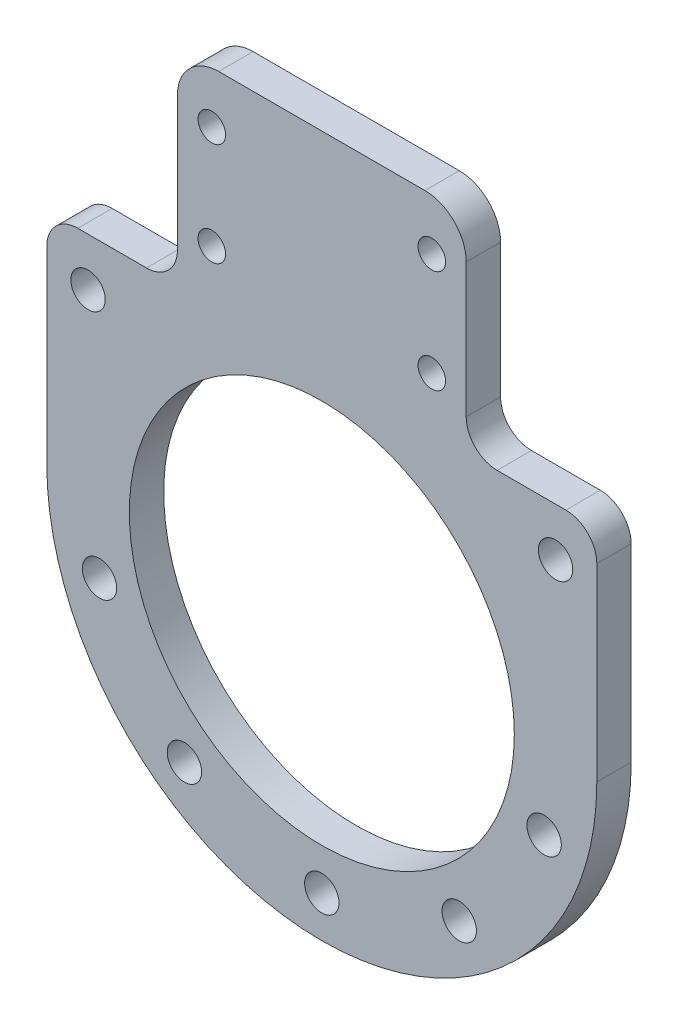
ISO-10303-21;
HEADER;
FILE_DESCRIPTION(('STEP AP214'),'2;1');
FILE_NAME('part.step','',(''),(''),'','','');
FILE_SCHEMA(('AUTOMOTIVE_DESIGN { 1 0 10303 214 1 1 1 1 }'));
ENDSEC;
DATA;
#1=APPLICATION_CONTEXT('core data for automotive mechanical design processes');
#2=APPLICATION_PROTOCOL_DEFINITION('international standard','automotive_design',2000,#1);
#3=PRODUCT_CONTEXT('',#1,'mechanical');
#4=PRODUCT('Part','Part','',(#3));
#5=PRODUCT_RELATED_PRODUCT_CATEGORY('part','',(#4));
#6=PRODUCT_DEFINITION_FORMATION('','',#4);
#7=PRODUCT_DEFINITION_CONTEXT('part definition',#1,'design');
#8=PRODUCT_DEFINITION('design','',#6,#7);
#9=PRODUCT_DEFINITION_SHAPE('','',#8);
#10=(LENGTH_UNIT() NAMED_UNIT(*) SI_UNIT(.MILLI.,.METRE.));
#11=(NAMED_UNIT(*) PLANE_ANGLE_UNIT() SI_UNIT($,.RADIAN.));
#12=(NAMED_UNIT(*) SI_UNIT($,.STERADIAN.) SOLID_ANGLE_UNIT());
#13=UNCERTAINTY_MEASURE_WITH_UNIT(LENGTH_MEASURE(1.E-05),#10,'distance_accuracy_value','');
#14=(GEOMETRIC_REPRESENTATION_CONTEXT(3) GLOBAL_UNCERTAINTY_ASSIGNED_CONTEXT((#13)) GLOBAL_UNIT_ASSIGNED_CONTEXT((#10,
#11,#12)) REPRESENTATION_CONTEXT('',''));
#15=CARTESIAN_POINT('',(0.,0.,0.));
#16=DIRECTION('',(0.,0.,1.));
#17=DIRECTION('',(1.,0.,0.));
#18=AXIS2_PLACEMENT_3D('',#15,#16,#17);
#19=CARTESIAN_POINT('',(-26.,-32.8765293462021,5.));
#20=DIRECTION('',(1.,0.,0.));
#21=DIRECTION('',(0.,0.,-1.));
#22=AXIS2_PLACEMENT_3D('',#19,#20,#21);
#23=PLANE('',#22);
#24=DIRECTION('',(0.,-1.,0.));
#25=VECTOR('',#24,1.);
#26=CARTESIAN_POINT('',(-26.,-32.8765293462021,5.));
#27=LINE('',#26,#25);
#28=CARTESIAN_POINT('',(-26.,-5.37652934620214,5.));
#29=VERTEX_POINT('',#28);
#30=CARTESIAN_POINT('',(-26.,-32.8765293462021,5.));
#31=VERTEX_POINT('',#30);
#32=EDGE_CURVE('E140',#29,#31,#27,.T.);
#33=ORIENTED_EDGE('',*,*,#32,.F.);
#34=DIRECTION('',(0.,0.,1.));
#35=VECTOR('',#34,1.);
#36=CARTESIAN_POINT('',(-26.,-5.37652934620214,5.));
#37=LINE('',#36,#35);
#38=CARTESIAN_POINT('',(-26.,-5.37652934620214,0.));
#39=VERTEX_POINT('',#38);
#40=EDGE_CURVE('E198',#29,#39,#37,.F.);
#41=ORIENTED_EDGE('',*,*,#40,.T.);
#42=DIRECTION('',(0.,-1.,0.));
#43=VECTOR('',#42,1.);
#44=CARTESIAN_POINT('',(-26.,-32.8765293462021,0.));
#45=LINE('',#44,#43);
#46=CARTESIAN_POINT('',(-26.,-32.8765293462021,0.));
#47=VERTEX_POINT('',#46);
#48=EDGE_CURVE('E165',#39,#47,#45,.T.);
#49=ORIENTED_EDGE('',*,*,#48,.T.);
#50=DIRECTION('',(0.,0.,-1.));
#51=VECTOR('',#50,1.);
#52=CARTESIAN_POINT('',(-26.,-32.8765293462021,5.));
#53=LINE('',#52,#51);
#54=EDGE_CURVE('E158',#31,#47,#53,.T.);
#55=ORIENTED_EDGE('',*,*,#54,.F.);
#56=EDGE_LOOP('',(#33,#41,#49,#55));
#57=FACE_BOUND('',#56,.T.);
#58=ADVANCED_FACE('F37',(#57),#23,.F.);
#59=CARTESIAN_POINT('',(14.,-32.8765293462021,5.));
#60=DIRECTION('',(0.,0.,-1.));
#61=DIRECTION('',(-1.,0.,0.));
#62=AXIS2_PLACEMENT_3D('',#59,#60,#61);
#63=CYLINDRICAL_SURFACE('',#62,40.);
#64=CARTESIAN_POINT('',(14.,-32.8765293462021,0.));
#65=DIRECTION('',(0.,0.,1.));
#66=DIRECTION('',(1.,0.,0.));
#67=AXIS2_PLACEMENT_3D('',#64,#65,#66);
#68=CIRCLE('',#67,40.);
#69=CARTESIAN_POINT('',(54.,-32.8765293462021,0.));
#70=VERTEX_POINT('',#69);
#71=EDGE_CURVE('E264',#47,#70,#68,.T.);
#72=ORIENTED_EDGE('',*,*,#71,.T.);
#73=DIRECTION('',(0.,0.,-1.));
#74=VECTOR('',#73,1.);
#75=CARTESIAN_POINT('',(54.,-32.8765293462021,5.));
#76=LINE('',#75,#74);
#77=CARTESIAN_POINT('',(54.,-32.8765293462021,5.));
#78=VERTEX_POINT('',#77);
#79=EDGE_CURVE('E160',#78,#70,#76,.T.);
#80=ORIENTED_EDGE('',*,*,#79,.F.);
#81=CARTESIAN_POINT('',(14.,-32.8765293462021,5.));
#82=DIRECTION('',(0.,0.,1.));
#83=DIRECTION('',(1.,0.,0.));
#84=AXIS2_PLACEMENT_3D('',#81,#82,#83);
#85=CIRCLE('',#84,40.);
#86=EDGE_CURVE('E146',#31,#78,#85,.T.);
#87=ORIENTED_EDGE('',*,*,#86,.F.);
#88=ORIENTED_EDGE('',*,*,#54,.T.);
#89=EDGE_LOOP('',(#72,#80,#87,#88));
#90=FACE_BOUND('',#89,.T.);
#91=ADVANCED_FACE('F157',(#90),#63,.T.);
#92=CARTESIAN_POINT('',(54.,29.1234706537979,5.));
#93=DIRECTION('',(-1.,0.,0.));
#94=DIRECTION('',(0.,-1.,0.));
#95=AXIS2_PLACEMENT_3D('',#92,#93,#94);
#96=PLANE('',#95);
#97=DIRECTION('',(0.,1.,0.));
#98=VECTOR('',#97,1.);
#99=CARTESIAN_POINT('',(54.,29.1234706537979,0.));
#100=LINE('',#99,#98);
#101=CARTESIAN_POINT('',(54.,-5.37652934620214,0.));
#102=VERTEX_POINT('',#101);
#103=EDGE_CURVE('E229',#70,#102,#100,.T.);
#104=ORIENTED_EDGE('',*,*,#103,.T.);
#105=DIRECTION('',(0.,0.,1.));
#106=VECTOR('',#105,1.);
#107=CARTESIAN_POINT('',(54.,-5.37652934620214,5.));
#108=LINE('',#107,#106);
#109=CARTESIAN_POINT('',(54.,-5.37652934620214,5.));
#110=VERTEX_POINT('',#109);
#111=EDGE_CURVE('E167',#102,#110,#108,.T.);
#112=ORIENTED_EDGE('',*,*,#111,.T.);
#113=DIRECTION('',(0.,1.,0.));
#114=VECTOR('',#113,1.);
#115=CARTESIAN_POINT('',(54.,29.1234706537979,5.));
#116=LINE('',#115,#114);
#117=EDGE_CURVE('E162',#78,#110,#116,.T.);
#118=ORIENTED_EDGE('',*,*,#117,.F.);
#119=ORIENTED_EDGE('',*,*,#79,.T.);
#120=EDGE_LOOP('',(#104,#112,#118,#119));
#121=FACE_BOUND('',#120,.T.);
#122=ADVANCED_FACE('F270',(#121),#96,.F.);
#123=CARTESIAN_POINT('',(-26.,29.1234706537979,5.));
#124=DIRECTION('',(0.,-1.,0.));
#125=DIRECTION('',(0.,0.,-1.));
#126=AXIS2_PLACEMENT_3D('',#123,#124,#125);
#127=PLANE('',#126);
#128=DIRECTION('',(-1.,0.,0.));
#129=VECTOR('',#128,1.);
#130=CARTESIAN_POINT('',(-26.,29.1234706537979,0.));
#131=LINE('',#130,#129);
#132=CARTESIAN_POINT('',(29.,29.1234706537979,0.));
#133=VERTEX_POINT('',#132);
#134=CARTESIAN_POINT('',(-0.999999999999997,29.1234706537979,0.));
#135=VERTEX_POINT('',#134);
#136=EDGE_CURVE('E153',#133,#135,#131,.T.);
#137=ORIENTED_EDGE('',*,*,#136,.T.);
#138=DIRECTION('',(0.,0.,1.));
#139=VECTOR('',#138,1.);
#140=CARTESIAN_POINT('',(-0.999999999999997,29.1234706537979,5.));
#141=LINE('',#140,#139);
#142=CARTESIAN_POINT('',(-0.999999999999997,29.1234706537979,5.));
#143=VERTEX_POINT('',#142);
#144=EDGE_CURVE('E211',#135,#143,#141,.T.);
#145=ORIENTED_EDGE('',*,*,#144,.T.);
#146=DIRECTION('',(-1.,0.,0.));
#147=VECTOR('',#146,1.);
#148=CARTESIAN_POINT('',(-26.,29.1234706537979,5.));
#149=LINE('',#148,#147);
#150=CARTESIAN_POINT('',(29.,29.1234706537979,5.));
#151=VERTEX_POINT('',#150);
#152=EDGE_CURVE('E172',#151,#143,#149,.T.);
#153=ORIENTED_EDGE('',*,*,#152,.F.);
#154=DIRECTION('',(0.,0.,1.));
#155=VECTOR('',#154,1.);
#156=CARTESIAN_POINT('',(29.,29.1234706537979,5.));
#157=LINE('',#156,#155);
#158=EDGE_CURVE('E209',#151,#133,#157,.F.);
#159=ORIENTED_EDGE('',*,*,#158,.T.);
#160=EDGE_LOOP('',(#137,#145,#153,#159));
#161=FACE_BOUND('',#160,.T.);
#162=ADVANCED_FACE('F226',(#161),#127,.F.);
#163=CARTESIAN_POINT('',(14.,-32.8765293462021,5.));
#164=DIRECTION('',(0.,0.,1.));
#165=DIRECTION('',(1.,0.,0.));
#166=AXIS2_PLACEMENT_3D('',#163,#164,#165);
#167=PLANE('',#166);
#168=CARTESIAN_POINT('',(-2.,21.6234706537979,5.));
#169=DIRECTION('',(0.,0.,1.));
#170=DIRECTION('',(1.,0.,0.));
#171=AXIS2_PLACEMENT_3D('',#168,#169,#170);
#172=CIRCLE('',#171,2.);
#173=CARTESIAN_POINT('',(0.,21.6234706537979,5.));
#174=VERTEX_POINT('',#173);
#175=EDGE_CURVE('E389',#174,#174,#172,.T.);
#176=ORIENTED_EDGE('',*,*,#175,.F.);
#177=EDGE_LOOP('',(#176));
#178=FACE_BOUND('',#177,.T.);
#179=CARTESIAN_POINT('',(30.,21.6234706537979,5.));
#180=DIRECTION('',(0.,0.,1.));
#181=DIRECTION('',(1.,0.,0.));
#182=AXIS2_PLACEMENT_3D('',#179,#180,#181);
#183=CIRCLE('',#182,2.00000000000001);
#184=CARTESIAN_POINT('',(32.,21.6234706537979,5.));
#185=VERTEX_POINT('',#184);
#186=EDGE_CURVE('E383',#185,#185,#183,.T.);
#187=ORIENTED_EDGE('',*,*,#186,.F.);
#188=EDGE_LOOP('',(#187));
#189=FACE_BOUND('',#188,.T.);
#190=CARTESIAN_POINT('',(30.,6.62347065379786,5.));
#191=DIRECTION('',(0.,0.,1.));
#192=DIRECTION('',(1.,0.,0.));
#193=AXIS2_PLACEMENT_3D('',#190,#191,#192);
#194=CIRCLE('',#193,2.00000000000001);
#195=CARTESIAN_POINT('',(32.,6.62347065379786,5.));
#196=VERTEX_POINT('',#195);
#197=EDGE_CURVE('E377',#196,#196,#194,.T.);
#198=ORIENTED_EDGE('',*,*,#197,.F.);
#199=EDGE_LOOP('',(#198));
#200=FACE_BOUND('',#199,.T.);
#201=CARTESIAN_POINT('',(-2.,6.62347065379786,5.));
#202=DIRECTION('',(0.,0.,1.));
#203=DIRECTION('',(1.,0.,0.));
#204=AXIS2_PLACEMENT_3D('',#201,#202,#203);
#205=CIRCLE('',#204,2.);
#206=CARTESIAN_POINT('',(0.,6.62347065379786,5.));
#207=VERTEX_POINT('',#206);
#208=EDGE_CURVE('E371',#207,#207,#205,.T.);
#209=ORIENTED_EDGE('',*,*,#208,.F.);
#210=EDGE_LOOP('',(#209));
#211=FACE_BOUND('',#210,.T.);
#212=CARTESIAN_POINT('',(-5.98469857794412,-60.3831071549503,5.));
#213=DIRECTION('',(0.,0.,1.));
#214=DIRECTION('',(1.,0.,0.));
#215=AXIS2_PLACEMENT_3D('',#212,#213,#214);
#216=CIRCLE('',#215,2.50000000000001);
#217=CARTESIAN_POINT('',(-3.48469857794411,-60.3831071549503,5.));
#218=VERTEX_POINT('',#217);
#219=EDGE_CURVE('E366',#218,#218,#216,.T.);
#220=ORIENTED_EDGE('',*,*,#219,.F.);
#221=EDGE_LOOP('',(#220));
#222=FACE_BOUND('',#221,.T.);
#223=CARTESIAN_POINT('',(-18.3359215540352,-43.3831071549503,5.));
#224=DIRECTION('',(0.,0.,1.));
#225=DIRECTION('',(1.,0.,0.));
#226=AXIS2_PLACEMENT_3D('',#223,#224,#225);
#227=CIRCLE('',#226,2.5);
#228=CARTESIAN_POINT('',(-15.8359215540352,-43.3831071549503,5.));
#229=VERTEX_POINT('',#228);
#230=EDGE_CURVE('E360',#229,#229,#227,.T.);
#231=ORIENTED_EDGE('',*,*,#230,.F.);
#232=EDGE_LOOP('',(#231));
#233=FACE_BOUND('',#232,.T.);
#234=CARTESIAN_POINT('',(46.3359215540351,-43.3831071549507,5.));
#235=DIRECTION('',(0.,0.,1.));
#236=DIRECTION('',(1.,0.,0.));
#237=AXIS2_PLACEMENT_3D('',#234,#235,#236);
#238=CIRCLE('',#237,2.49999999999999);
#239=CARTESIAN_POINT('',(48.8359215540351,-43.3831071549507,5.));
#240=VERTEX_POINT('',#239);
#241=EDGE_CURVE('E354',#240,#240,#238,.T.);
#242=ORIENTED_EDGE('',*,*,#241,.F.);
#243=EDGE_LOOP('',(#242));
#244=FACE_BOUND('',#243,.T.);
#245=CARTESIAN_POINT('',(33.9846985779437,-60.3831071549506,5.));
#246=DIRECTION('',(0.,0.,1.));
#247=DIRECTION('',(1.,0.,0.));
#248=AXIS2_PLACEMENT_3D('',#245,#246,#247);
#249=CIRCLE('',#248,2.5);
#250=CARTESIAN_POINT('',(36.4846985779437,-60.3831071549506,5.));
#251=VERTEX_POINT('',#250);
#252=EDGE_CURVE('E347',#251,#251,#249,.T.);
#253=ORIENTED_EDGE('',*,*,#252,.F.);
#254=EDGE_LOOP('',(#253));
#255=FACE_BOUND('',#254,.T.);
#256=CARTESIAN_POINT('',(14.,-66.8765293462021,5.));
#257=DIRECTION('',(0.,0.,1.));
#258=DIRECTION('',(1.,0.,0.));
#259=AXIS2_PLACEMENT_3D('',#256,#257,#258);
#260=CIRCLE('',#259,2.5);
#261=CARTESIAN_POINT('',(16.5,-66.8765293462021,5.));
#262=VERTEX_POINT('',#261);
#263=EDGE_CURVE('E341',#262,#262,#260,.T.);
#264=ORIENTED_EDGE('',*,*,#263,.F.);
#265=EDGE_LOOP('',(#264));
#266=FACE_BOUND('',#265,.T.);
#267=CARTESIAN_POINT('',(48.,-7.87652934620214,5.));
#268=DIRECTION('',(0.,0.,1.));
#269=DIRECTION('',(1.,0.,0.));
#270=AXIS2_PLACEMENT_3D('',#267,#268,#269);
#271=CIRCLE('',#270,2.5);
#272=CARTESIAN_POINT('',(50.5,-7.87652934620214,5.));
#273=VERTEX_POINT('',#272);
#274=EDGE_CURVE('E335',#273,#273,#271,.T.);
#275=ORIENTED_EDGE('',*,*,#274,.F.);
#276=EDGE_LOOP('',(#275));
#277=FACE_BOUND('',#276,.T.);
#278=CARTESIAN_POINT('',(-20.,-7.87652934620214,5.));
#279=DIRECTION('',(0.,0.,1.));
#280=DIRECTION('',(1.,0.,0.));
#281=AXIS2_PLACEMENT_3D('',#278,#279,#280);
#282=CIRCLE('',#281,2.5);
#283=CARTESIAN_POINT('',(-17.5,-7.87652934620214,5.));
#284=VERTEX_POINT('',#283);
#285=EDGE_CURVE('E329',#284,#284,#282,.T.);
#286=ORIENTED_EDGE('',*,*,#285,.F.);
#287=EDGE_LOOP('',(#286));
#288=FACE_BOUND('',#287,.T.);
#289=ORIENTED_EDGE('',*,*,#152,.T.);
#290=CARTESIAN_POINT('',(-0.999999999999997,23.1234706537979,5.));
#291=DIRECTION('',(0.,0.,1.));
#292=DIRECTION('',(1.,0.,0.));
#293=AXIS2_PLACEMENT_3D('',#290,#291,#292);
#294=CIRCLE('',#293,6.);
#295=CARTESIAN_POINT('',(-7.,23.1234706537979,5.));
#296=VERTEX_POINT('',#295);
#297=EDGE_CURVE('E216',#143,#296,#294,.T.);
#298=ORIENTED_EDGE('',*,*,#297,.T.);
#299=DIRECTION('',(0.,1.,0.));
#300=VECTOR('',#299,1.);
#301=CARTESIAN_POINT('',(-7.,29.1234706537979,5.));
#302=LINE('',#301,#300);
#303=CARTESIAN_POINT('',(-7.,3.62347065379787,5.));
#304=VERTEX_POINT('',#303);
#305=EDGE_CURVE('E232',#304,#296,#302,.T.);
#306=ORIENTED_EDGE('',*,*,#305,.F.);
#307=CARTESIAN_POINT('',(-11.5,3.62347065379786,5.));
#308=DIRECTION('',(0.,0.,1.));
#309=DIRECTION('',(1.,0.,0.));
#310=AXIS2_PLACEMENT_3D('',#307,#308,#309);
#311=CIRCLE('',#310,4.5);
#312=CARTESIAN_POINT('',(-11.5,-0.87652934620214,5.));
#313=VERTEX_POINT('',#312);
#314=EDGE_CURVE('E205',#304,#313,#311,.F.);
#315=ORIENTED_EDGE('',*,*,#314,.T.);
#316=DIRECTION('',(1.,0.,0.));
#317=VECTOR('',#316,1.);
#318=CARTESIAN_POINT('',(-7.,-0.87652934620214,5.));
#319=LINE('',#318,#317);
#320=CARTESIAN_POINT('',(-21.5,-0.876529346202141,5.));
#321=VERTEX_POINT('',#320);
#322=EDGE_CURVE('E236',#321,#313,#319,.T.);
#323=ORIENTED_EDGE('',*,*,#322,.F.);
#324=CARTESIAN_POINT('',(-21.5,-5.37652934620214,5.));
#325=DIRECTION('',(0.,0.,1.));
#326=DIRECTION('',(1.,0.,0.));
#327=AXIS2_PLACEMENT_3D('',#324,#325,#326);
#328=CIRCLE('',#327,4.5);
#329=EDGE_CURVE('E149',#321,#29,#328,.T.);
#330=ORIENTED_EDGE('',*,*,#329,.T.);
#331=ORIENTED_EDGE('',*,*,#32,.T.);
#332=ORIENTED_EDGE('',*,*,#86,.T.);
#333=ORIENTED_EDGE('',*,*,#117,.T.);
#334=CARTESIAN_POINT('',(49.5,-5.37652934620214,5.));
#335=DIRECTION('',(0.,0.,1.));
#336=DIRECTION('',(1.,0.,0.));
#337=AXIS2_PLACEMENT_3D('',#334,#335,#336);
#338=CIRCLE('',#337,4.5);
#339=CARTESIAN_POINT('',(49.5,-0.876529346202145,5.));
#340=VERTEX_POINT('',#339);
#341=EDGE_CURVE('E170',#110,#340,#338,.T.);
#342=ORIENTED_EDGE('',*,*,#341,.T.);
#343=DIRECTION('',(1.,0.,0.));
#344=VECTOR('',#343,1.);
#345=CARTESIAN_POINT('',(54.,-0.876529346202144,5.));
#346=LINE('',#345,#344);
#347=CARTESIAN_POINT('',(39.5,-0.876529346202146,5.));
#348=VERTEX_POINT('',#347);
#349=EDGE_CURVE('E248',#348,#340,#346,.T.);
#350=ORIENTED_EDGE('',*,*,#349,.F.);
#351=CARTESIAN_POINT('',(39.5,3.62347065379785,5.));
#352=DIRECTION('',(0.,0.,1.));
#353=DIRECTION('',(1.,0.,0.));
#354=AXIS2_PLACEMENT_3D('',#351,#352,#353);
#355=CIRCLE('',#354,4.5);
#356=CARTESIAN_POINT('',(35.,3.62347065379785,5.));
#357=VERTEX_POINT('',#356);
#358=EDGE_CURVE('E187',#348,#357,#355,.F.);
#359=ORIENTED_EDGE('',*,*,#358,.T.);
#360=DIRECTION('',(0.,-1.,0.));
#361=VECTOR('',#360,1.);
#362=CARTESIAN_POINT('',(35.,-0.876529346202147,5.));
#363=LINE('',#362,#361);
#364=CARTESIAN_POINT('',(35.,23.1234706537978,5.));
#365=VERTEX_POINT('',#364);
#366=EDGE_CURVE('E252',#365,#357,#363,.T.);
#367=ORIENTED_EDGE('',*,*,#366,.F.);
#368=CARTESIAN_POINT('',(29.,23.1234706537979,5.));
#369=DIRECTION('',(0.,0.,1.));
#370=DIRECTION('',(1.,0.,0.));
#371=AXIS2_PLACEMENT_3D('',#368,#369,#370);
#372=CIRCLE('',#371,6.);
#373=EDGE_CURVE('E214',#365,#151,#372,.T.);
#374=ORIENTED_EDGE('',*,*,#373,.T.);
#375=EDGE_LOOP('',(#289,#298,#306,#315,#323,#330,#331,#332,#333,#342,#350,#359,#367,#374));
#376=FACE_BOUND('',#375,.T.);
#377=CARTESIAN_POINT('',(14.,-32.8765293462021,5.));
#378=DIRECTION('',(0.,0.,1.));
#379=DIRECTION('',(1.,0.,0.));
#380=AXIS2_PLACEMENT_3D('',#377,#378,#379);
#381=CIRCLE('',#380,28.);
#382=CARTESIAN_POINT('',(42.,-32.8765293462021,5.));
#383=VERTEX_POINT('',#382);
#384=EDGE_CURVE('E251',#383,#383,#381,.T.);
#385=ORIENTED_EDGE('',*,*,#384,.F.);
#386=EDGE_LOOP('',(#385));
#387=FACE_BOUND('',#386,.T.);
#388=ADVANCED_FACE('F143',(#178,#189,#200,#211,#222,#233,#244,#255,#266,#277,#288,#376,#387),
#167,.T.);
#389=CARTESIAN_POINT('',(14.,-32.8765293462021,0.));
#390=DIRECTION('',(0.,0.,1.));
#391=DIRECTION('',(1.,0.,0.));
#392=AXIS2_PLACEMENT_3D('',#389,#390,#391);
#393=PLANE('',#392);
#394=CARTESIAN_POINT('',(-2.,21.6234706537979,0.));
#395=DIRECTION('',(0.,0.,1.));
#396=DIRECTION('',(1.,0.,0.));
#397=AXIS2_PLACEMENT_3D('',#394,#395,#396);
#398=CIRCLE('',#397,2.);
#399=CARTESIAN_POINT('',(0.,21.6234706537979,0.));
#400=VERTEX_POINT('',#399);
#401=EDGE_CURVE('E374',#400,#400,#398,.T.);
#402=ORIENTED_EDGE('',*,*,#401,.T.);
#403=EDGE_LOOP('',(#402));
#404=FACE_BOUND('',#403,.T.);
#405=CARTESIAN_POINT('',(30.,21.6234706537979,0.));
#406=DIRECTION('',(0.,0.,1.));
#407=DIRECTION('',(1.,0.,0.));
#408=AXIS2_PLACEMENT_3D('',#405,#406,#407);
#409=CIRCLE('',#408,2.00000000000001);
#410=CARTESIAN_POINT('',(32.,21.6234706537979,0.));
#411=VERTEX_POINT('',#410);
#412=EDGE_CURVE('E386',#411,#411,#409,.T.);
#413=ORIENTED_EDGE('',*,*,#412,.T.);
#414=EDGE_LOOP('',(#413));
#415=FACE_BOUND('',#414,.T.);
#416=CARTESIAN_POINT('',(30.,6.62347065379786,0.));
#417=DIRECTION('',(0.,0.,1.));
#418=DIRECTION('',(1.,0.,0.));
#419=AXIS2_PLACEMENT_3D('',#416,#417,#418);
#420=CIRCLE('',#419,2.00000000000001);
#421=CARTESIAN_POINT('',(32.,6.62347065379786,0.));
#422=VERTEX_POINT('',#421);
#423=EDGE_CURVE('E380',#422,#422,#420,.T.);
#424=ORIENTED_EDGE('',*,*,#423,.T.);
#425=EDGE_LOOP('',(#424));
#426=FACE_BOUND('',#425,.T.);
#427=CARTESIAN_POINT('',(-2.,6.62347065379786,0.));
#428=DIRECTION('',(0.,0.,1.));
#429=DIRECTION('',(1.,0.,0.));
#430=AXIS2_PLACEMENT_3D('',#427,#428,#429);
#431=CIRCLE('',#430,2.);
#432=CARTESIAN_POINT('',(0.,6.62347065379786,0.));
#433=VERTEX_POINT('',#432);
#434=EDGE_CURVE('E351',#433,#433,#431,.T.);
#435=ORIENTED_EDGE('',*,*,#434,.T.);
#436=EDGE_LOOP('',(#435));
#437=FACE_BOUND('',#436,.T.);
#438=CARTESIAN_POINT('',(-5.98469857794412,-60.3831071549503,0.));
#439=DIRECTION('',(0.,0.,1.));
#440=DIRECTION('',(1.,0.,0.));
#441=AXIS2_PLACEMENT_3D('',#438,#439,#440);
#442=CIRCLE('',#441,2.50000000000001);
#443=CARTESIAN_POINT('',(-3.48469857794411,-60.3831071549503,0.));
#444=VERTEX_POINT('',#443);
#445=EDGE_CURVE('E344',#444,#444,#442,.T.);
#446=ORIENTED_EDGE('',*,*,#445,.T.);
#447=EDGE_LOOP('',(#446));
#448=FACE_BOUND('',#447,.T.);
#449=CARTESIAN_POINT('',(-18.3359215540352,-43.3831071549503,0.));
#450=DIRECTION('',(0.,0.,1.));
#451=DIRECTION('',(1.,0.,0.));
#452=AXIS2_PLACEMENT_3D('',#449,#450,#451);
#453=CIRCLE('',#452,2.5);
#454=CARTESIAN_POINT('',(-15.8359215540352,-43.3831071549503,0.));
#455=VERTEX_POINT('',#454);
#456=EDGE_CURVE('E363',#455,#455,#453,.T.);
#457=ORIENTED_EDGE('',*,*,#456,.T.);
#458=EDGE_LOOP('',(#457));
#459=FACE_BOUND('',#458,.T.);
#460=CARTESIAN_POINT('',(46.3359215540351,-43.3831071549507,0.));
#461=DIRECTION('',(0.,0.,1.));
#462=DIRECTION('',(1.,0.,0.));
#463=AXIS2_PLACEMENT_3D('',#460,#461,#462);
#464=CIRCLE('',#463,2.49999999999999);
#465=CARTESIAN_POINT('',(48.8359215540351,-43.3831071549507,0.));
#466=VERTEX_POINT('',#465);
#467=EDGE_CURVE('E357',#466,#466,#464,.T.);
#468=ORIENTED_EDGE('',*,*,#467,.T.);
#469=EDGE_LOOP('',(#468));
#470=FACE_BOUND('',#469,.T.);
#471=CARTESIAN_POINT('',(33.9846985779437,-60.3831071549506,0.));
#472=DIRECTION('',(0.,0.,1.));
#473=DIRECTION('',(1.,0.,0.));
#474=AXIS2_PLACEMENT_3D('',#471,#472,#473);
#475=CIRCLE('',#474,2.5);
#476=CARTESIAN_POINT('',(36.4846985779437,-60.3831071549506,0.));
#477=VERTEX_POINT('',#476);
#478=EDGE_CURVE('E350',#477,#477,#475,.T.);
#479=ORIENTED_EDGE('',*,*,#478,.T.);
#480=EDGE_LOOP('',(#479));
#481=FACE_BOUND('',#480,.T.);
#482=CARTESIAN_POINT('',(14.,-66.8765293462021,0.));
#483=DIRECTION('',(0.,0.,1.));
#484=DIRECTION('',(1.,0.,0.));
#485=AXIS2_PLACEMENT_3D('',#482,#483,#484);
#486=CIRCLE('',#485,2.5);
#487=CARTESIAN_POINT('',(16.5,-66.8765293462021,0.));
#488=VERTEX_POINT('',#487);
#489=EDGE_CURVE('E338',#488,#488,#486,.T.);
#490=ORIENTED_EDGE('',*,*,#489,.T.);
#491=EDGE_LOOP('',(#490));
#492=FACE_BOUND('',#491,.T.);
#493=CARTESIAN_POINT('',(48.,-7.87652934620214,0.));
#494=DIRECTION('',(0.,0.,1.));
#495=DIRECTION('',(1.,0.,0.));
#496=AXIS2_PLACEMENT_3D('',#493,#494,#495);
#497=CIRCLE('',#496,2.5);
#498=CARTESIAN_POINT('',(50.5,-7.87652934620214,0.));
#499=VERTEX_POINT('',#498);
#500=EDGE_CURVE('E332',#499,#499,#497,.T.);
#501=ORIENTED_EDGE('',*,*,#500,.T.);
#502=EDGE_LOOP('',(#501));
#503=FACE_BOUND('',#502,.T.);
#504=CARTESIAN_POINT('',(-20.,-7.87652934620214,0.));
#505=DIRECTION('',(0.,0.,1.));
#506=DIRECTION('',(1.,0.,0.));
#507=AXIS2_PLACEMENT_3D('',#504,#505,#506);
#508=CIRCLE('',#507,2.5);
#509=CARTESIAN_POINT('',(-17.5,-7.87652934620214,0.));
#510=VERTEX_POINT('',#509);
#511=EDGE_CURVE('E241',#510,#510,#508,.T.);
#512=ORIENTED_EDGE('',*,*,#511,.T.);
#513=EDGE_LOOP('',(#512));
#514=FACE_BOUND('',#513,.T.);
#515=CARTESIAN_POINT('',(14.,-32.8765293462021,0.));
#516=DIRECTION('',(0.,0.,1.));
#517=DIRECTION('',(1.,0.,0.));
#518=AXIS2_PLACEMENT_3D('',#515,#516,#517);
#519=CIRCLE('',#518,28.);
#520=CARTESIAN_POINT('',(42.,-32.8765293462021,0.));
#521=VERTEX_POINT('',#520);
#522=EDGE_CURVE('E256',#521,#521,#519,.T.);
#523=ORIENTED_EDGE('',*,*,#522,.T.);
#524=EDGE_LOOP('',(#523));
#525=FACE_BOUND('',#524,.T.);
#526=DIRECTION('',(0.,1.,0.));
#527=VECTOR('',#526,1.);
#528=CARTESIAN_POINT('',(-7.,29.1234706537979,0.));
#529=LINE('',#528,#527);
#530=CARTESIAN_POINT('',(-7.,3.62347065379787,0.));
#531=VERTEX_POINT('',#530);
#532=CARTESIAN_POINT('',(-7.,23.1234706537979,0.));
#533=VERTEX_POINT('',#532);
#534=EDGE_CURVE('E222',#531,#533,#529,.T.);
#535=ORIENTED_EDGE('',*,*,#534,.T.);
#536=CARTESIAN_POINT('',(-0.999999999999997,23.1234706537979,0.));
#537=DIRECTION('',(0.,0.,1.));
#538=DIRECTION('',(1.,0.,0.));
#539=AXIS2_PLACEMENT_3D('',#536,#537,#538);
#540=CIRCLE('',#539,6.);
#541=EDGE_CURVE('E45',#533,#135,#540,.F.);
#542=ORIENTED_EDGE('',*,*,#541,.T.);
#543=ORIENTED_EDGE('',*,*,#136,.F.);
#544=CARTESIAN_POINT('',(29.,23.1234706537979,0.));
#545=DIRECTION('',(0.,0.,1.));
#546=DIRECTION('',(1.,0.,0.));
#547=AXIS2_PLACEMENT_3D('',#544,#545,#546);
#548=CIRCLE('',#547,6.);
#549=CARTESIAN_POINT('',(35.,23.1234706537978,0.));
#550=VERTEX_POINT('',#549);
#551=EDGE_CURVE('E52',#133,#550,#548,.F.);
#552=ORIENTED_EDGE('',*,*,#551,.T.);
#553=DIRECTION('',(0.,-1.,0.));
#554=VECTOR('',#553,1.);
#555=CARTESIAN_POINT('',(35.,-0.876529346202147,0.));
#556=LINE('',#555,#554);
#557=CARTESIAN_POINT('',(35.,3.62347065379785,0.));
#558=VERTEX_POINT('',#557);
#559=EDGE_CURVE('E245',#550,#558,#556,.T.);
#560=ORIENTED_EDGE('',*,*,#559,.T.);
#561=CARTESIAN_POINT('',(39.5,3.62347065379785,0.));
#562=DIRECTION('',(0.,0.,1.));
#563=DIRECTION('',(1.,0.,0.));
#564=AXIS2_PLACEMENT_3D('',#561,#562,#563);
#565=CIRCLE('',#564,4.5);
#566=CARTESIAN_POINT('',(39.5,-0.876529346202146,0.));
#567=VERTEX_POINT('',#566);
#568=EDGE_CURVE('E190',#558,#567,#565,.T.);
#569=ORIENTED_EDGE('',*,*,#568,.T.);
#570=DIRECTION('',(1.,0.,0.));
#571=VECTOR('',#570,1.);
#572=CARTESIAN_POINT('',(54.,-0.876529346202144,0.));
#573=LINE('',#572,#571);
#574=CARTESIAN_POINT('',(49.5,-0.876529346202145,0.));
#575=VERTEX_POINT('',#574);
#576=EDGE_CURVE('E247',#567,#575,#573,.T.);
#577=ORIENTED_EDGE('',*,*,#576,.T.);
#578=CARTESIAN_POINT('',(49.5,-5.37652934620214,0.));
#579=DIRECTION('',(0.,0.,1.));
#580=DIRECTION('',(1.,0.,0.));
#581=AXIS2_PLACEMENT_3D('',#578,#579,#580);
#582=CIRCLE('',#581,4.5);
#583=EDGE_CURVE('E182',#575,#102,#582,.F.);
#584=ORIENTED_EDGE('',*,*,#583,.T.);
#585=ORIENTED_EDGE('',*,*,#103,.F.);
#586=ORIENTED_EDGE('',*,*,#71,.F.);
#587=ORIENTED_EDGE('',*,*,#48,.F.);
#588=CARTESIAN_POINT('',(-21.5,-5.37652934620214,0.));
#589=DIRECTION('',(0.,0.,1.));
#590=DIRECTION('',(1.,0.,0.));
#591=AXIS2_PLACEMENT_3D('',#588,#589,#590);
#592=CIRCLE('',#591,4.5);
#593=CARTESIAN_POINT('',(-21.5,-0.876529346202141,0.));
#594=VERTEX_POINT('',#593);
#595=EDGE_CURVE('E200',#39,#594,#592,.F.);
#596=ORIENTED_EDGE('',*,*,#595,.T.);
#597=DIRECTION('',(1.,0.,0.));
#598=VECTOR('',#597,1.);
#599=CARTESIAN_POINT('',(-7.,-0.87652934620214,0.));
#600=LINE('',#599,#598);
#601=CARTESIAN_POINT('',(-11.5,-0.87652934620214,0.));
#602=VERTEX_POINT('',#601);
#603=EDGE_CURVE('E235',#594,#602,#600,.T.);
#604=ORIENTED_EDGE('',*,*,#603,.T.);
#605=CARTESIAN_POINT('',(-11.5,3.62347065379786,0.));
#606=DIRECTION('',(0.,0.,1.));
#607=DIRECTION('',(1.,0.,0.));
#608=AXIS2_PLACEMENT_3D('',#605,#606,#607);
#609=CIRCLE('',#608,4.5);
#610=EDGE_CURVE('E207',#602,#531,#609,.T.);
#611=ORIENTED_EDGE('',*,*,#610,.T.);
#612=EDGE_LOOP('',(#535,#542,#543,#552,#560,#569,#577,#584,#585,#586,#587,#596,#604,#611));
#613=FACE_BOUND('',#612,.T.);
#614=ADVANCED_FACE('F221',(#404,#415,#426,#437,#448,#459,#470,#481,#492,#503,#514,#525,#613),
#393,.F.);
#615=CARTESIAN_POINT('',(14.,-32.8765293462021,0.));
#616=DIRECTION('',(0.,0.,1.));
#617=DIRECTION('',(1.,0.,0.));
#618=AXIS2_PLACEMENT_3D('',#615,#616,#617);
#619=CYLINDRICAL_SURFACE('',#618,28.);
#620=ORIENTED_EDGE('',*,*,#522,.F.);
#621=EDGE_LOOP('',(#620));
#622=FACE_BOUND('',#621,.T.);
#623=ORIENTED_EDGE('',*,*,#384,.T.);
#624=EDGE_LOOP('',(#623));
#625=FACE_BOUND('',#624,.T.);
#626=ADVANCED_FACE('F443',(#622,#625),#619,.F.);
#627=CARTESIAN_POINT('',(54.,-0.876529346202144,0.));
#628=DIRECTION('',(0.,-1.,0.));
#629=DIRECTION('',(1.,0.,0.));
#630=AXIS2_PLACEMENT_3D('',#627,#628,#629);
#631=PLANE('',#630);
#632=ORIENTED_EDGE('',*,*,#349,.T.);
#633=DIRECTION('',(0.,0.,1.));
#634=VECTOR('',#633,1.);
#635=CARTESIAN_POINT('',(49.5,-0.876529346202145,0.));
#636=LINE('',#635,#634);
#637=EDGE_CURVE('E180',#340,#575,#636,.F.);
#638=ORIENTED_EDGE('',*,*,#637,.T.);
#639=ORIENTED_EDGE('',*,*,#576,.F.);
#640=DIRECTION('',(0.,0.,1.));
#641=VECTOR('',#640,1.);
#642=CARTESIAN_POINT('',(39.5,-0.876529346202146,5.));
#643=LINE('',#642,#641);
#644=EDGE_CURVE('E177',#567,#348,#643,.T.);
#645=ORIENTED_EDGE('',*,*,#644,.T.);
#646=EDGE_LOOP('',(#632,#638,#639,#645));
#647=FACE_BOUND('',#646,.T.);
#648=ADVANCED_FACE('F277',(#647),#631,.F.);
#649=CARTESIAN_POINT('',(35.,-0.876529346202147,0.));
#650=DIRECTION('',(-1.,0.,0.));
#651=DIRECTION('',(0.,0.,1.));
#652=AXIS2_PLACEMENT_3D('',#649,#650,#651);
#653=PLANE('',#652);
#654=ORIENTED_EDGE('',*,*,#559,.F.);
#655=DIRECTION('',(0.,0.,1.));
#656=VECTOR('',#655,1.);
#657=CARTESIAN_POINT('',(35.,23.1234706537979,0.));
#658=LINE('',#657,#656);
#659=EDGE_CURVE('E11',#550,#365,#658,.T.);
#660=ORIENTED_EDGE('',*,*,#659,.T.);
#661=ORIENTED_EDGE('',*,*,#366,.T.);
#662=DIRECTION('',(0.,0.,1.));
#663=VECTOR('',#662,1.);
#664=CARTESIAN_POINT('',(35.,3.62347065379785,0.));
#665=LINE('',#664,#663);
#666=EDGE_CURVE('E184',#357,#558,#665,.F.);
#667=ORIENTED_EDGE('',*,*,#666,.T.);
#668=EDGE_LOOP('',(#654,#660,#661,#667));
#669=FACE_BOUND('',#668,.T.);
#670=ADVANCED_FACE('F286',(#669),#653,.F.);
#671=CARTESIAN_POINT('',(49.5,-5.37652934620214,5.));
#672=DIRECTION('',(0.,0.,1.));
#673=DIRECTION('',(1.,0.,0.));
#674=AXIS2_PLACEMENT_3D('',#671,#672,#673);
#675=CYLINDRICAL_SURFACE('',#674,4.5);
#676=ORIENTED_EDGE('',*,*,#583,.F.);
#677=ORIENTED_EDGE('',*,*,#637,.F.);
#678=ORIENTED_EDGE('',*,*,#341,.F.);
#679=ORIENTED_EDGE('',*,*,#111,.F.);
#680=EDGE_LOOP('',(#676,#677,#678,#679));
#681=FACE_BOUND('',#680,.T.);
#682=ADVANCED_FACE('F273',(#681),#675,.T.);
#683=CARTESIAN_POINT('',(39.5,3.62347065379785,0.));
#684=DIRECTION('',(0.,0.,-1.));
#685=DIRECTION('',(-1.,0.,0.));
#686=AXIS2_PLACEMENT_3D('',#683,#684,#685);
#687=CYLINDRICAL_SURFACE('',#686,4.5);
#688=ORIENTED_EDGE('',*,*,#568,.F.);
#689=ORIENTED_EDGE('',*,*,#666,.F.);
#690=ORIENTED_EDGE('',*,*,#358,.F.);
#691=ORIENTED_EDGE('',*,*,#644,.F.);
#692=EDGE_LOOP('',(#688,#689,#690,#691));
#693=FACE_BOUND('',#692,.T.);
#694=ADVANCED_FACE('F282',(#693),#687,.F.);
#695=CARTESIAN_POINT('',(-7.,29.1234706537979,0.));
#696=DIRECTION('',(1.,0.,0.));
#697=DIRECTION('',(0.,1.,0.));
#698=AXIS2_PLACEMENT_3D('',#695,#696,#697);
#699=PLANE('',#698);
#700=ORIENTED_EDGE('',*,*,#305,.T.);
#701=DIRECTION('',(0.,0.,1.));
#702=VECTOR('',#701,1.);
#703=CARTESIAN_POINT('',(-7.,23.1234706537979,0.));
#704=LINE('',#703,#702);
#705=EDGE_CURVE('E60',#296,#533,#704,.F.);
#706=ORIENTED_EDGE('',*,*,#705,.T.);
#707=ORIENTED_EDGE('',*,*,#534,.F.);
#708=DIRECTION('',(0.,0.,1.));
#709=VECTOR('',#708,1.);
#710=CARTESIAN_POINT('',(-7.,3.62347065379786,5.));
#711=LINE('',#710,#709);
#712=EDGE_CURVE('E202',#531,#304,#711,.T.);
#713=ORIENTED_EDGE('',*,*,#712,.T.);
#714=EDGE_LOOP('',(#700,#706,#707,#713));
#715=FACE_BOUND('',#714,.T.);
#716=ADVANCED_FACE('F233',(#715),#699,.F.);
#717=CARTESIAN_POINT('',(-7.,-0.87652934620214,0.));
#718=DIRECTION('',(0.,-1.,0.));
#719=DIRECTION('',(1.,0.,0.));
#720=AXIS2_PLACEMENT_3D('',#717,#718,#719);
#721=PLANE('',#720);
#722=ORIENTED_EDGE('',*,*,#603,.F.);
#723=DIRECTION('',(0.,0.,1.));
#724=VECTOR('',#723,1.);
#725=CARTESIAN_POINT('',(-21.5,-0.876529346202141,0.));
#726=LINE('',#725,#724);
#727=EDGE_CURVE('E194',#594,#321,#726,.T.);
#728=ORIENTED_EDGE('',*,*,#727,.T.);
#729=ORIENTED_EDGE('',*,*,#322,.T.);
#730=DIRECTION('',(0.,0.,1.));
#731=VECTOR('',#730,1.);
#732=CARTESIAN_POINT('',(-11.5,-0.87652934620214,0.));
#733=LINE('',#732,#731);
#734=EDGE_CURVE('E192',#313,#602,#733,.F.);
#735=ORIENTED_EDGE('',*,*,#734,.T.);
#736=EDGE_LOOP('',(#722,#728,#729,#735));
#737=FACE_BOUND('',#736,.T.);
#738=ADVANCED_FACE('F315',(#737),#721,.F.);
#739=CARTESIAN_POINT('',(-21.5,-5.37652934620214,0.));
#740=DIRECTION('',(0.,0.,1.));
#741=DIRECTION('',(1.,0.,0.));
#742=AXIS2_PLACEMENT_3D('',#739,#740,#741);
#743=CYLINDRICAL_SURFACE('',#742,4.5);
#744=ORIENTED_EDGE('',*,*,#595,.F.);
#745=ORIENTED_EDGE('',*,*,#40,.F.);
#746=ORIENTED_EDGE('',*,*,#329,.F.);
#747=ORIENTED_EDGE('',*,*,#727,.F.);
#748=EDGE_LOOP('',(#744,#745,#746,#747));
#749=FACE_BOUND('',#748,.T.);
#750=ADVANCED_FACE('F311',(#749),#743,.T.);
#751=CARTESIAN_POINT('',(-11.5,3.62347065379786,0.));
#752=DIRECTION('',(0.,0.,-1.));
#753=DIRECTION('',(-1.,0.,0.));
#754=AXIS2_PLACEMENT_3D('',#751,#752,#753);
#755=CYLINDRICAL_SURFACE('',#754,4.5);
#756=ORIENTED_EDGE('',*,*,#610,.F.);
#757=ORIENTED_EDGE('',*,*,#734,.F.);
#758=ORIENTED_EDGE('',*,*,#314,.F.);
#759=ORIENTED_EDGE('',*,*,#712,.F.);
#760=EDGE_LOOP('',(#756,#757,#758,#759));
#761=FACE_BOUND('',#760,.T.);
#762=ADVANCED_FACE('F314',(#761),#755,.F.);
#763=CARTESIAN_POINT('',(-20.,-7.87652934620214,0.));
#764=DIRECTION('',(0.,0.,1.));
#765=DIRECTION('',(1.,0.,0.));
#766=AXIS2_PLACEMENT_3D('',#763,#764,#765);
#767=CYLINDRICAL_SURFACE('',#766,2.5);
#768=ORIENTED_EDGE('',*,*,#511,.F.);
#769=EDGE_LOOP('',(#768));
#770=FACE_BOUND('',#769,.T.);
#771=ORIENTED_EDGE('',*,*,#285,.T.);
#772=EDGE_LOOP('',(#771));
#773=FACE_BOUND('',#772,.T.);
#774=ADVANCED_FACE('F318',(#770,#773),#767,.F.);
#775=CARTESIAN_POINT('',(48.,-7.87652934620214,0.));
#776=DIRECTION('',(0.,0.,1.));
#777=DIRECTION('',(1.,0.,0.));
#778=AXIS2_PLACEMENT_3D('',#775,#776,#777);
#779=CYLINDRICAL_SURFACE('',#778,2.5);
#780=ORIENTED_EDGE('',*,*,#500,.F.);
#781=EDGE_LOOP('',(#780));
#782=FACE_BOUND('',#781,.T.);
#783=ORIENTED_EDGE('',*,*,#274,.T.);
#784=EDGE_LOOP('',(#783));
#785=FACE_BOUND('',#784,.T.);
#786=ADVANCED_FACE('F298',(#782,#785),#779,.F.);
#787=CARTESIAN_POINT('',(-0.999999999999997,23.1234706537979,5.));
#788=DIRECTION('',(0.,0.,1.));
#789=DIRECTION('',(1.,0.,0.));
#790=AXIS2_PLACEMENT_3D('',#787,#788,#789);
#791=CYLINDRICAL_SURFACE('',#790,6.);
#792=ORIENTED_EDGE('',*,*,#541,.F.);
#793=ORIENTED_EDGE('',*,*,#705,.F.);
#794=ORIENTED_EDGE('',*,*,#297,.F.);
#795=ORIENTED_EDGE('',*,*,#144,.F.);
#796=EDGE_LOOP('',(#792,#793,#794,#795));
#797=FACE_BOUND('',#796,.T.);
#798=ADVANCED_FACE('F230',(#797),#791,.T.);
#799=CARTESIAN_POINT('',(29.,23.1234706537979,0.));
#800=DIRECTION('',(0.,0.,1.));
#801=DIRECTION('',(1.,0.,0.));
#802=AXIS2_PLACEMENT_3D('',#799,#800,#801);
#803=CYLINDRICAL_SURFACE('',#802,6.);
#804=ORIENTED_EDGE('',*,*,#551,.F.);
#805=ORIENTED_EDGE('',*,*,#158,.F.);
#806=ORIENTED_EDGE('',*,*,#373,.F.);
#807=ORIENTED_EDGE('',*,*,#659,.F.);
#808=EDGE_LOOP('',(#804,#805,#806,#807));
#809=FACE_BOUND('',#808,.T.);
#810=ADVANCED_FACE('F39',(#809),#803,.T.);
#811=CARTESIAN_POINT('',(14.,-66.8765293462021,0.));
#812=DIRECTION('',(0.,0.,1.));
#813=DIRECTION('',(1.,0.,0.));
#814=AXIS2_PLACEMENT_3D('',#811,#812,#813);
#815=CYLINDRICAL_SURFACE('',#814,2.5);
#816=ORIENTED_EDGE('',*,*,#489,.F.);
#817=EDGE_LOOP('',(#816));
#818=FACE_BOUND('',#817,.T.);
#819=ORIENTED_EDGE('',*,*,#263,.T.);
#820=EDGE_LOOP('',(#819));
#821=FACE_BOUND('',#820,.T.);
#822=ADVANCED_FACE('F290',(#818,#821),#815,.F.);
#823=CARTESIAN_POINT('',(33.9846985779437,-60.3831071549506,0.));
#824=DIRECTION('',(0.,0.,1.));
#825=DIRECTION('',(1.,0.,0.));
#826=AXIS2_PLACEMENT_3D('',#823,#824,#825);
#827=CYLINDRICAL_SURFACE('',#826,2.5);
#828=ORIENTED_EDGE('',*,*,#478,.F.);
#829=EDGE_LOOP('',(#828));
#830=FACE_BOUND('',#829,.T.);
#831=ORIENTED_EDGE('',*,*,#252,.T.);
#832=EDGE_LOOP('',(#831));
#833=FACE_BOUND('',#832,.T.);
#834=ADVANCED_FACE('F295',(#830,#833),#827,.F.);
#835=CARTESIAN_POINT('',(46.3359215540351,-43.3831071549507,0.));
#836=DIRECTION('',(0.,0.,1.));
#837=DIRECTION('',(1.,0.,0.));
#838=AXIS2_PLACEMENT_3D('',#835,#836,#837);
#839=CYLINDRICAL_SURFACE('',#838,2.49999999999999);
#840=ORIENTED_EDGE('',*,*,#467,.F.);
#841=EDGE_LOOP('',(#840));
#842=FACE_BOUND('',#841,.T.);
#843=ORIENTED_EDGE('',*,*,#241,.T.);
#844=EDGE_LOOP('',(#843));
#845=FACE_BOUND('',#844,.T.);
#846=ADVANCED_FACE('F541',(#842,#845),#839,.F.);
#847=CARTESIAN_POINT('',(-18.3359215540352,-43.3831071549503,0.));
#848=DIRECTION('',(0.,0.,1.));
#849=DIRECTION('',(1.,0.,0.));
#850=AXIS2_PLACEMENT_3D('',#847,#848,#849);
#851=CYLINDRICAL_SURFACE('',#850,2.5);
#852=ORIENTED_EDGE('',*,*,#456,.F.);
#853=EDGE_LOOP('',(#852));
#854=FACE_BOUND('',#853,.T.);
#855=ORIENTED_EDGE('',*,*,#230,.T.);
#856=EDGE_LOOP('',(#855));
#857=FACE_BOUND('',#856,.T.);
#858=ADVANCED_FACE('F549',(#854,#857),#851,.F.);
#859=CARTESIAN_POINT('',(-5.98469857794412,-60.3831071549503,0.));
#860=DIRECTION('',(0.,0.,1.));
#861=DIRECTION('',(1.,0.,0.));
#862=AXIS2_PLACEMENT_3D('',#859,#860,#861);
#863=CYLINDRICAL_SURFACE('',#862,2.50000000000001);
#864=ORIENTED_EDGE('',*,*,#445,.F.);
#865=EDGE_LOOP('',(#864));
#866=FACE_BOUND('',#865,.T.);
#867=ORIENTED_EDGE('',*,*,#219,.T.);
#868=EDGE_LOOP('',(#867));
#869=FACE_BOUND('',#868,.T.);
#870=ADVANCED_FACE('F558',(#866,#869),#863,.F.);
#871=CARTESIAN_POINT('',(-2.,6.62347065379786,0.));
#872=DIRECTION('',(0.,0.,1.));
#873=DIRECTION('',(1.,0.,0.));
#874=AXIS2_PLACEMENT_3D('',#871,#872,#873);
#875=CYLINDRICAL_SURFACE('',#874,2.);
#876=ORIENTED_EDGE('',*,*,#434,.F.);
#877=EDGE_LOOP('',(#876));
#878=FACE_BOUND('',#877,.T.);
#879=ORIENTED_EDGE('',*,*,#208,.T.);
#880=EDGE_LOOP('',(#879));
#881=FACE_BOUND('',#880,.T.);
#882=ADVANCED_FACE('F566',(#878,#881),#875,.F.);
#883=CARTESIAN_POINT('',(30.,6.62347065379786,0.));
#884=DIRECTION('',(0.,0.,1.));
#885=DIRECTION('',(1.,0.,0.));
#886=AXIS2_PLACEMENT_3D('',#883,#884,#885);
#887=CYLINDRICAL_SURFACE('',#886,2.00000000000001);
#888=ORIENTED_EDGE('',*,*,#423,.F.);
#889=EDGE_LOOP('',(#888));
#890=FACE_BOUND('',#889,.T.);
#891=ORIENTED_EDGE('',*,*,#197,.T.);
#892=EDGE_LOOP('',(#891));
#893=FACE_BOUND('',#892,.T.);
#894=ADVANCED_FACE('F574',(#890,#893),#887,.F.);
#895=CARTESIAN_POINT('',(30.,21.6234706537979,0.));
#896=DIRECTION('',(0.,0.,1.));
#897=DIRECTION('',(1.,0.,0.));
#898=AXIS2_PLACEMENT_3D('',#895,#896,#897);
#899=CYLINDRICAL_SURFACE('',#898,2.00000000000001);
#900=ORIENTED_EDGE('',*,*,#412,.F.);
#901=EDGE_LOOP('',(#900));
#902=FACE_BOUND('',#901,.T.);
#903=ORIENTED_EDGE('',*,*,#186,.T.);
#904=EDGE_LOOP('',(#903));
#905=FACE_BOUND('',#904,.T.);
#906=ADVANCED_FACE('F400',(#902,#905),#899,.F.);
#907=CARTESIAN_POINT('',(-2.,21.6234706537979,0.));
#908=DIRECTION('',(0.,0.,1.));
#909=DIRECTION('',(1.,0.,0.));
#910=AXIS2_PLACEMENT_3D('',#907,#908,#909);
#911=CYLINDRICAL_SURFACE('',#910,2.);
#912=ORIENTED_EDGE('',*,*,#401,.F.);
#913=EDGE_LOOP('',(#912));
#914=FACE_BOUND('',#913,.T.);
#915=ORIENTED_EDGE('',*,*,#175,.T.);
#916=EDGE_LOOP('',(#915));
#917=FACE_BOUND('',#916,.T.);
#918=ADVANCED_FACE('F397',(#914,#917),#911,.F.);
#919=CLOSED_SHELL('',(#58,#91,#122,#162,#388,#614,#626,#648,#670,#682,#694,#716,#738,#750,#762,
#774,#786,#798,#810,#822,#834,#846,#858,#870,#882,#894,#906,#918));
#920=MANIFOLD_SOLID_BREP('B2',#919);
#921=ADVANCED_BREP_SHAPE_REPRESENTATION('',(#18,#920),#14);
#922=SHAPE_DEFINITION_REPRESENTATION(#9,#921);
ENDSEC;
END-ISO-10303-21;
